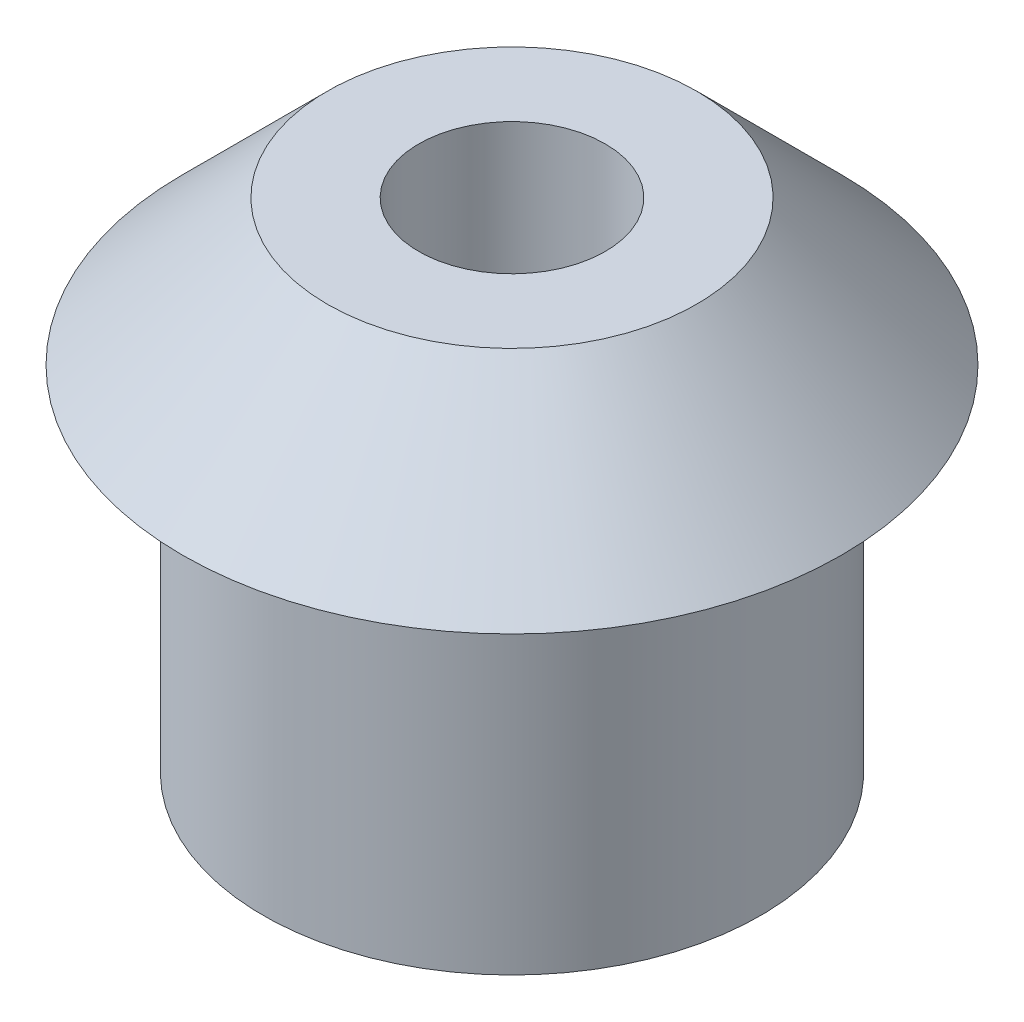
ISO-10303-21;
HEADER;
FILE_DESCRIPTION(('STEP AP214'),'2;1');
FILE_NAME('part.step','',(''),(''),'','','');
FILE_SCHEMA(('AUTOMOTIVE_DESIGN { 1 0 10303 214 1 1 1 1 }'));
ENDSEC;
DATA;
#1=APPLICATION_CONTEXT('core data for automotive mechanical design processes');
#2=APPLICATION_PROTOCOL_DEFINITION('international standard','automotive_design',2000,#1);
#3=PRODUCT_CONTEXT('',#1,'mechanical');
#4=PRODUCT('Part','Part','',(#3));
#5=PRODUCT_RELATED_PRODUCT_CATEGORY('part','',(#4));
#6=PRODUCT_DEFINITION_FORMATION('','',#4);
#7=PRODUCT_DEFINITION_CONTEXT('part definition',#1,'design');
#8=PRODUCT_DEFINITION('design','',#6,#7);
#9=PRODUCT_DEFINITION_SHAPE('','',#8);
#10=(LENGTH_UNIT() NAMED_UNIT(*) SI_UNIT(.MILLI.,.METRE.));
#11=(NAMED_UNIT(*) PLANE_ANGLE_UNIT() SI_UNIT($,.RADIAN.));
#12=(NAMED_UNIT(*) SI_UNIT($,.STERADIAN.) SOLID_ANGLE_UNIT());
#13=UNCERTAINTY_MEASURE_WITH_UNIT(LENGTH_MEASURE(1.E-05),#10,'distance_accuracy_value','');
#14=(GEOMETRIC_REPRESENTATION_CONTEXT(3) GLOBAL_UNCERTAINTY_ASSIGNED_CONTEXT((#13)) GLOBAL_UNIT_ASSIGNED_CONTEXT((#10,
#11,#12)) REPRESENTATION_CONTEXT('',''));
#15=CARTESIAN_POINT('',(0.,0.,0.));
#16=DIRECTION('',(0.,0.,1.));
#17=DIRECTION('',(1.,0.,0.));
#18=AXIS2_PLACEMENT_3D('',#15,#16,#17);
#19=CARTESIAN_POINT('',(0.,0.,0.));
#20=DIRECTION('',(0.,1.,0.));
#21=DIRECTION('',(0.,0.,1.));
#22=AXIS2_PLACEMENT_3D('',#19,#20,#21);
#23=PLANE('',#22);
#24=CARTESIAN_POINT('',(0.,0.,0.));
#25=DIRECTION('',(0.,1.,0.));
#26=DIRECTION('',(0.,0.,1.));
#27=AXIS2_PLACEMENT_3D('',#24,#25,#26);
#28=CIRCLE('',#27,4.);
#29=CARTESIAN_POINT('',(0.,0.,-4.));
#30=VERTEX_POINT('',#29);
#31=EDGE_CURVE('E39',#30,#30,#28,.T.);
#32=ORIENTED_EDGE('',*,*,#31,.F.);
#33=EDGE_LOOP('',(#32));
#34=FACE_BOUND('',#33,.T.);
#35=CARTESIAN_POINT('',(0.,0.,0.));
#36=DIRECTION('',(0.,1.,0.));
#37=DIRECTION('',(0.,0.,1.));
#38=AXIS2_PLACEMENT_3D('',#35,#36,#37);
#39=CIRCLE('',#38,1.5);
#40=CARTESIAN_POINT('',(0.,0.,-1.5));
#41=VERTEX_POINT('',#40);
#42=EDGE_CURVE('E46',#41,#41,#39,.T.);
#43=ORIENTED_EDGE('',*,*,#42,.T.);
#44=EDGE_LOOP('',(#43));
#45=FACE_BOUND('',#44,.T.);
#46=ADVANCED_FACE('F35',(#34,#45),#23,.F.);
#47=CARTESIAN_POINT('',(0.,5.67,0.));
#48=DIRECTION('',(0.,-1.,0.));
#49=DIRECTION('',(0.,0.,-1.));
#50=AXIS2_PLACEMENT_3D('',#47,#48,#49);
#51=CYLINDRICAL_SURFACE('',#50,4.);
#52=CARTESIAN_POINT('',(0.,5.67,0.));
#53=DIRECTION('',(0.,1.,0.));
#54=DIRECTION('',(0.,0.,1.));
#55=AXIS2_PLACEMENT_3D('',#52,#53,#54);
#56=CIRCLE('',#55,4.);
#57=CARTESIAN_POINT('',(0.,5.67,-4.));
#58=VERTEX_POINT('',#57);
#59=EDGE_CURVE('E10',#58,#58,#56,.T.);
#60=CARTESIAN_POINT('',(0.,5.67,-4.));
#61=CARTESIAN_POINT('',(0.,5.6109375,-4.));
#62=CARTESIAN_POINT('',(0.,5.551875,-4.));
#63=CARTESIAN_POINT('',(0.,5.43375,-4.));
#64=CARTESIAN_POINT('',(0.,5.3746875,-4.));
#65=CARTESIAN_POINT('',(0.,5.2565625,-4.));
#66=CARTESIAN_POINT('',(0.,5.1975,-4.));
#67=CARTESIAN_POINT('',(0.,5.079375,-4.));
#68=CARTESIAN_POINT('',(0.,5.0203125,-4.));
#69=CARTESIAN_POINT('',(0.,4.9021875,-4.));
#70=CARTESIAN_POINT('',(0.,4.843125,-4.));
#71=CARTESIAN_POINT('',(0.,4.725,-4.));
#72=CARTESIAN_POINT('',(0.,4.6659375,-4.));
#73=CARTESIAN_POINT('',(0.,4.5478125,-4.));
#74=CARTESIAN_POINT('',(0.,4.48875,-4.));
#75=CARTESIAN_POINT('',(0.,4.370625,-4.));
#76=CARTESIAN_POINT('',(0.,4.3115625,-4.));
#77=CARTESIAN_POINT('',(0.,4.1934375,-4.));
#78=CARTESIAN_POINT('',(0.,4.134375,-4.));
#79=CARTESIAN_POINT('',(0.,4.01625,-4.));
#80=CARTESIAN_POINT('',(0.,3.9571875,-4.));
#81=CARTESIAN_POINT('',(0.,3.8390625,-4.));
#82=CARTESIAN_POINT('',(0.,3.78,-4.));
#83=CARTESIAN_POINT('',(0.,3.661875,-4.));
#84=CARTESIAN_POINT('',(0.,3.6028125,-4.));
#85=CARTESIAN_POINT('',(0.,3.4846875,-4.));
#86=CARTESIAN_POINT('',(0.,3.425625,-4.));
#87=CARTESIAN_POINT('',(0.,3.3075,-4.));
#88=CARTESIAN_POINT('',(0.,3.2484375,-4.));
#89=CARTESIAN_POINT('',(0.,3.1303125,-4.));
#90=CARTESIAN_POINT('',(0.,3.07125,-4.));
#91=CARTESIAN_POINT('',(0.,2.953125,-4.));
#92=CARTESIAN_POINT('',(0.,2.8940625,-4.));
#93=CARTESIAN_POINT('',(0.,2.7759375,-4.));
#94=CARTESIAN_POINT('',(0.,2.716875,-4.));
#95=CARTESIAN_POINT('',(0.,2.59875,-4.));
#96=CARTESIAN_POINT('',(0.,2.5396875,-4.));
#97=CARTESIAN_POINT('',(0.,2.4215625,-4.));
#98=CARTESIAN_POINT('',(0.,2.3625,-4.));
#99=CARTESIAN_POINT('',(0.,2.244375,-4.));
#100=CARTESIAN_POINT('',(0.,2.1853125,-4.));
#101=CARTESIAN_POINT('',(0.,2.0671875,-4.));
#102=CARTESIAN_POINT('',(0.,2.008125,-4.));
#103=CARTESIAN_POINT('',(0.,1.89,-4.));
#104=CARTESIAN_POINT('',(0.,1.8309375,-4.));
#105=CARTESIAN_POINT('',(0.,1.7128125,-4.));
#106=CARTESIAN_POINT('',(0.,1.65375,-4.));
#107=CARTESIAN_POINT('',(0.,1.535625,-4.));
#108=CARTESIAN_POINT('',(0.,1.4765625,-4.));
#109=CARTESIAN_POINT('',(0.,1.3584375,-4.));
#110=CARTESIAN_POINT('',(0.,1.299375,-4.));
#111=CARTESIAN_POINT('',(0.,1.18125,-4.));
#112=CARTESIAN_POINT('',(0.,1.1221875,-4.));
#113=CARTESIAN_POINT('',(0.,1.0040625,-4.));
#114=CARTESIAN_POINT('',(0.,0.944999999999999,-4.));
#115=CARTESIAN_POINT('',(0.,0.826874999999999,-4.));
#116=CARTESIAN_POINT('',(0.,0.767812499999999,-4.));
#117=CARTESIAN_POINT('',(0.,0.649687499999999,-4.));
#118=CARTESIAN_POINT('',(0.,0.590624999999999,-4.));
#119=CARTESIAN_POINT('',(0.,0.472499999999999,-4.));
#120=CARTESIAN_POINT('',(0.,0.413437499999999,-4.));
#121=CARTESIAN_POINT('',(0.,0.2953125,-4.));
#122=CARTESIAN_POINT('',(0.,0.236249999999999,-4.));
#123=CARTESIAN_POINT('',(0.,0.118124999999999,-4.));
#124=CARTESIAN_POINT('',(0.,0.0590624999999993,-4.));
#125=CARTESIAN_POINT('',(0.,0.,-4.));
#126=B_SPLINE_CURVE_WITH_KNOTS('',3,(#60,#61,#62,#63,#64,#65,#66,#67,#68,#69,#70,#71,#72,#73,
#74,#75,#76,#77,#78,#79,#80,#81,#82,#83,#84,#85,#86,#87,#88,#89,#90,#91,#92,#93,#94,#95,#96,#97,
#98,#99,#100,#101,#102,#103,#104,#105,#106,#107,#108,#109,#110,#111,#112,#113,#114,#115,#116,
#117,#118,#119,#120,#121,#122,#123,#124,#125),.UNSPECIFIED.,.F.,.F.,(4,2,2,2,2,2,2,2,2,2,2,2,2,
2,2,2,2,2,2,2,2,2,2,2,2,2,2,2,2,2,2,2,4),(0.,0.1771875,0.354375000000001,0.531562500000001,
0.70875,0.8859375,1.063125,1.2403125,1.4175,1.5946875,1.771875,1.9490625,2.12625,2.3034375,
2.480625,2.6578125,2.835,3.0121875,3.189375,3.3665625,3.54375,3.7209375,3.898125,4.0753125,
4.2525,4.4296875,4.606875,4.7840625,4.96125,5.1384375,5.315625,5.4928125,5.67),.UNSPECIFIED.);
#127=EDGE_CURVE('BSEAM37',#58,#30,#126,.T.);
#128=ORIENTED_EDGE('',*,*,#59,.F.);
#129=ORIENTED_EDGE('',*,*,#31,.T.);
#130=ORIENTED_EDGE('',*,*,#127,.T.);
#131=ORIENTED_EDGE('',*,*,#127,.F.);
#132=EDGE_LOOP('',(#128,#130,#129,#131));
#133=FACE_BOUND('',#132,.T.);
#134=ADVANCED_FACE('F37',(#133),#51,.T.);
#135=CARTESIAN_POINT('',(0.,5.67,0.));
#136=DIRECTION('',(0.,-1.,0.));
#137=DIRECTION('',(0.,0.,-1.));
#138=AXIS2_PLACEMENT_3D('',#135,#136,#137);
#139=CYLINDRICAL_SURFACE('',#138,1.5);
#140=CARTESIAN_POINT('',(0.,8.,0.));
#141=DIRECTION('',(0.,1.,0.));
#142=DIRECTION('',(0.,0.,1.));
#143=AXIS2_PLACEMENT_3D('',#140,#141,#142);
#144=CIRCLE('',#143,1.5);
#145=CARTESIAN_POINT('',(0.,8.,-1.5));
#146=VERTEX_POINT('',#145);
#147=EDGE_CURVE('E56',#146,#146,#144,.T.);
#148=CARTESIAN_POINT('',(0.,0.,-1.5));
#149=CARTESIAN_POINT('',(0.,0.0833333333333325,-1.5));
#150=CARTESIAN_POINT('',(0.,0.166666666666666,-1.5));
#151=CARTESIAN_POINT('',(0.,0.333333333333333,-1.5));
#152=CARTESIAN_POINT('',(0.,0.416666666666666,-1.5));
#153=CARTESIAN_POINT('',(0.,0.583333333333333,-1.5));
#154=CARTESIAN_POINT('',(0.,0.666666666666666,-1.5));
#155=CARTESIAN_POINT('',(0.,0.833333333333332,-1.5));
#156=CARTESIAN_POINT('',(0.,0.916666666666666,-1.5));
#157=CARTESIAN_POINT('',(0.,1.08333333333333,-1.5));
#158=CARTESIAN_POINT('',(0.,1.16666666666667,-1.5));
#159=CARTESIAN_POINT('',(0.,1.33333333333333,-1.5));
#160=CARTESIAN_POINT('',(0.,1.41666666666667,-1.5));
#161=CARTESIAN_POINT('',(0.,1.58333333333333,-1.5));
#162=CARTESIAN_POINT('',(0.,1.66666666666667,-1.5));
#163=CARTESIAN_POINT('',(0.,1.83333333333333,-1.5));
#164=CARTESIAN_POINT('',(0.,1.91666666666667,-1.5));
#165=CARTESIAN_POINT('',(0.,2.08333333333333,-1.5));
#166=CARTESIAN_POINT('',(0.,2.16666666666667,-1.5));
#167=CARTESIAN_POINT('',(0.,2.33333333333333,-1.5));
#168=CARTESIAN_POINT('',(0.,2.41666666666667,-1.5));
#169=CARTESIAN_POINT('',(0.,2.58333333333333,-1.5));
#170=CARTESIAN_POINT('',(0.,2.66666666666667,-1.5));
#171=CARTESIAN_POINT('',(0.,2.83333333333333,-1.5));
#172=CARTESIAN_POINT('',(0.,2.91666666666667,-1.5));
#173=CARTESIAN_POINT('',(0.,3.08333333333333,-1.5));
#174=CARTESIAN_POINT('',(0.,3.16666666666667,-1.5));
#175=CARTESIAN_POINT('',(0.,3.33333333333333,-1.5));
#176=CARTESIAN_POINT('',(0.,3.41666666666667,-1.5));
#177=CARTESIAN_POINT('',(0.,3.58333333333333,-1.5));
#178=CARTESIAN_POINT('',(0.,3.66666666666666,-1.5));
#179=CARTESIAN_POINT('',(0.,3.83333333333333,-1.5));
#180=CARTESIAN_POINT('',(0.,3.91666666666666,-1.5));
#181=CARTESIAN_POINT('',(0.,4.08333333333333,-1.5));
#182=CARTESIAN_POINT('',(0.,4.16666666666667,-1.5));
#183=CARTESIAN_POINT('',(0.,4.33333333333333,-1.5));
#184=CARTESIAN_POINT('',(0.,4.41666666666667,-1.5));
#185=CARTESIAN_POINT('',(0.,4.58333333333333,-1.5));
#186=CARTESIAN_POINT('',(0.,4.66666666666667,-1.5));
#187=CARTESIAN_POINT('',(0.,4.83333333333333,-1.5));
#188=CARTESIAN_POINT('',(0.,4.91666666666666,-1.5));
#189=CARTESIAN_POINT('',(0.,5.08333333333333,-1.5));
#190=CARTESIAN_POINT('',(0.,5.16666666666667,-1.5));
#191=CARTESIAN_POINT('',(0.,5.33333333333333,-1.5));
#192=CARTESIAN_POINT('',(0.,5.41666666666667,-1.5));
#193=CARTESIAN_POINT('',(0.,5.58333333333333,-1.5));
#194=CARTESIAN_POINT('',(0.,5.66666666666666,-1.5));
#195=CARTESIAN_POINT('',(0.,5.83333333333333,-1.5));
#196=CARTESIAN_POINT('',(0.,5.91666666666666,-1.5));
#197=CARTESIAN_POINT('',(0.,6.08333333333333,-1.5));
#198=CARTESIAN_POINT('',(0.,6.16666666666667,-1.5));
#199=CARTESIAN_POINT('',(0.,6.33333333333333,-1.5));
#200=CARTESIAN_POINT('',(0.,6.41666666666667,-1.5));
#201=CARTESIAN_POINT('',(0.,6.58333333333333,-1.5));
#202=CARTESIAN_POINT('',(0.,6.66666666666667,-1.5));
#203=CARTESIAN_POINT('',(0.,6.83333333333333,-1.5));
#204=CARTESIAN_POINT('',(0.,6.91666666666666,-1.5));
#205=CARTESIAN_POINT('',(0.,7.08333333333333,-1.5));
#206=CARTESIAN_POINT('',(0.,7.16666666666667,-1.5));
#207=CARTESIAN_POINT('',(0.,7.33333333333333,-1.5));
#208=CARTESIAN_POINT('',(0.,7.41666666666667,-1.5));
#209=CARTESIAN_POINT('',(0.,7.58333333333333,-1.5));
#210=CARTESIAN_POINT('',(0.,7.66666666666666,-1.5));
#211=CARTESIAN_POINT('',(0.,7.83333333333333,-1.5));
#212=CARTESIAN_POINT('',(0.,7.91666666666667,-1.5));
#213=CARTESIAN_POINT('',(0.,8.,-1.5));
#214=B_SPLINE_CURVE_WITH_KNOTS('',3,(#148,#149,#150,#151,#152,#153,#154,#155,#156,#157,#158,
#159,#160,#161,#162,#163,#164,#165,#166,#167,#168,#169,#170,#171,#172,#173,#174,#175,#176,#177,
#178,#179,#180,#181,#182,#183,#184,#185,#186,#187,#188,#189,#190,#191,#192,#193,#194,#195,#196,
#197,#198,#199,#200,#201,#202,#203,#204,#205,#206,#207,#208,#209,#210,#211,#212,#213),
.UNSPECIFIED.,.F.,.F.,(4,2,2,2,2,2,2,2,2,2,2,2,2,2,2,2,2,2,2,2,2,2,2,2,2,2,2,2,2,2,2,2,4),(0.,
0.25,0.5,0.75,1.,1.25,1.5,1.75,2.,2.25,2.5,2.75,3.,3.25,3.5,3.75,4.,4.25,4.5,4.75,5.,5.25,5.5,
5.75,6.,6.25,6.5,6.75,7.,7.25,7.5,7.75,8.),.UNSPECIFIED.);
#215=EDGE_CURVE('BSEAM60',#41,#146,#214,.T.);
#216=ORIENTED_EDGE('',*,*,#42,.F.);
#217=ORIENTED_EDGE('',*,*,#147,.T.);
#218=ORIENTED_EDGE('',*,*,#215,.T.);
#219=ORIENTED_EDGE('',*,*,#215,.F.);
#220=EDGE_LOOP('',(#216,#218,#217,#219));
#221=FACE_BOUND('',#220,.T.);
#222=ADVANCED_FACE('F60',(#221),#139,.F.);
#223=CARTESIAN_POINT('',(0.,8.,0.));
#224=DIRECTION('',(0.,1.,0.));
#225=DIRECTION('',(0.,0.,1.));
#226=AXIS2_PLACEMENT_3D('',#223,#224,#225);
#227=PLANE('',#226);
#228=ORIENTED_EDGE('',*,*,#147,.F.);
#229=EDGE_LOOP('',(#228));
#230=FACE_BOUND('',#229,.T.);
#231=CARTESIAN_POINT('',(0.,8.,0.));
#232=DIRECTION('',(0.,-1.,0.));
#233=DIRECTION('',(0.,0.,-1.));
#234=AXIS2_PLACEMENT_3D('',#231,#232,#233);
#235=CIRCLE('',#234,2.97);
#236=CARTESIAN_POINT('',(0.,8.,-2.97));
#237=VERTEX_POINT('',#236);
#238=EDGE_CURVE('E50',#237,#237,#235,.T.);
#239=ORIENTED_EDGE('',*,*,#238,.F.);
#240=EDGE_LOOP('',(#239));
#241=FACE_BOUND('',#240,.T.);
#242=ADVANCED_FACE('F62',(#230,#241),#227,.T.);
#243=CARTESIAN_POINT('',(0.,5.67,0.));
#244=DIRECTION('',(0.,-1.,0.));
#245=DIRECTION('',(0.,0.,-1.));
#246=AXIS2_PLACEMENT_3D('',#243,#244,#245);
#247=CONICAL_SURFACE('',#246,5.3,0.785398163397448);
#248=ORIENTED_EDGE('',*,*,#238,.T.);
#249=EDGE_LOOP('',(#248));
#250=FACE_BOUND('',#249,.T.);
#251=CARTESIAN_POINT('',(0.,5.67,0.));
#252=DIRECTION('',(0.,-1.,0.));
#253=DIRECTION('',(0.,0.,-1.));
#254=AXIS2_PLACEMENT_3D('',#251,#252,#253);
#255=CIRCLE('',#254,5.3);
#256=CARTESIAN_POINT('',(0.,5.67,-5.3));
#257=VERTEX_POINT('',#256);
#258=EDGE_CURVE('E53',#257,#257,#255,.T.);
#259=ORIENTED_EDGE('',*,*,#258,.F.);
#260=EDGE_LOOP('',(#259));
#261=FACE_BOUND('',#260,.T.);
#262=ADVANCED_FACE('F65',(#250,#261),#247,.T.);
#263=CARTESIAN_POINT('',(0.,5.67,0.));
#264=DIRECTION('',(0.,-1.,0.));
#265=DIRECTION('',(0.,0.,-1.));
#266=AXIS2_PLACEMENT_3D('',#263,#264,#265);
#267=PLANE('',#266);
#268=ORIENTED_EDGE('',*,*,#59,.T.);
#269=EDGE_LOOP('',(#268));
#270=FACE_BOUND('',#269,.T.);
#271=ORIENTED_EDGE('',*,*,#258,.T.);
#272=EDGE_LOOP('',(#271));
#273=FACE_BOUND('',#272,.T.);
#274=ADVANCED_FACE('F71',(#270,#273),#267,.T.);
#275=CLOSED_SHELL('',(#46,#134,#222,#242,#262,#274));
#276=MANIFOLD_SOLID_BREP('B2',#275);
#277=ADVANCED_BREP_SHAPE_REPRESENTATION('',(#18,#276),#14);
#278=SHAPE_DEFINITION_REPRESENTATION(#9,#277);
ENDSEC;
END-ISO-10303-21;
